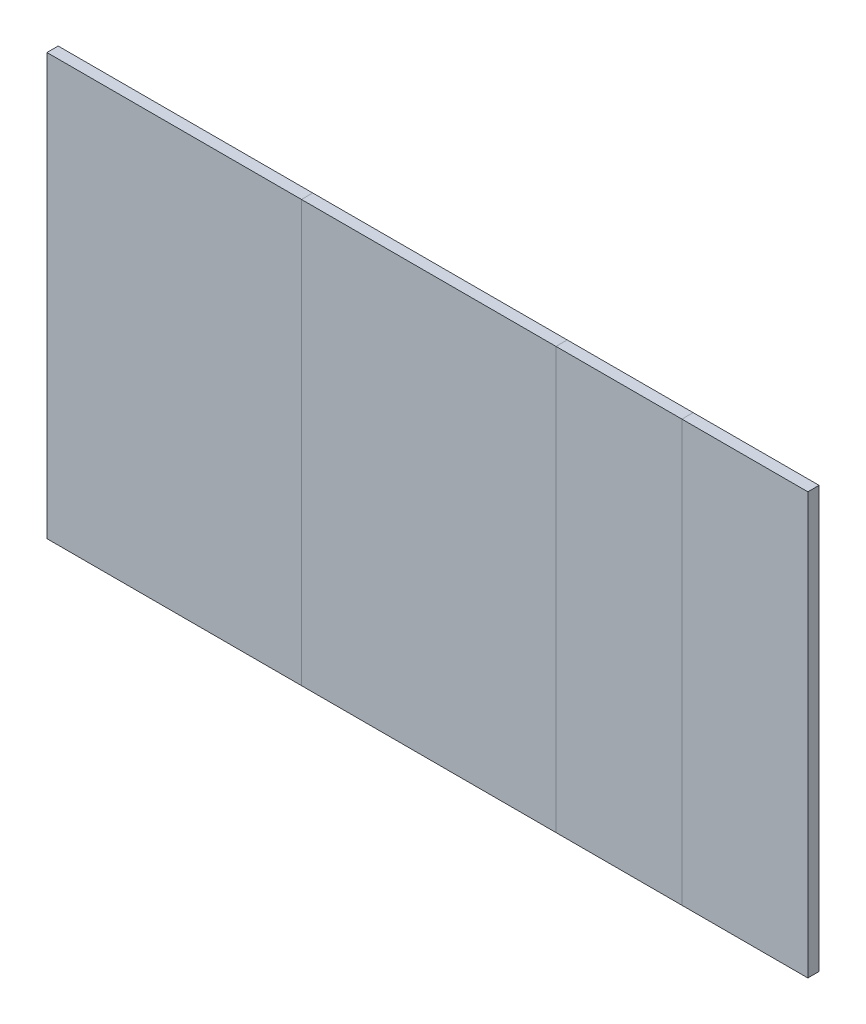
ISO-10303-21;
HEADER;
FILE_DESCRIPTION(('STEP AP214'),'2;1');
FILE_NAME('part.step','',(''),(''),'','','');
FILE_SCHEMA(('AUTOMOTIVE_DESIGN { 1 0 10303 214 1 1 1 1 }'));
ENDSEC;
DATA;
#1=APPLICATION_CONTEXT('core data for automotive mechanical design processes');
#2=APPLICATION_PROTOCOL_DEFINITION('international standard','automotive_design',2000,#1);
#3=PRODUCT_CONTEXT('',#1,'mechanical');
#4=PRODUCT('Part','Part','',(#3));
#5=PRODUCT_RELATED_PRODUCT_CATEGORY('part','',(#4));
#6=PRODUCT_DEFINITION_FORMATION('','',#4);
#7=PRODUCT_DEFINITION_CONTEXT('part definition',#1,'design');
#8=PRODUCT_DEFINITION('design','',#6,#7);
#9=PRODUCT_DEFINITION_SHAPE('','',#8);
#10=(LENGTH_UNIT() NAMED_UNIT(*) SI_UNIT(.MILLI.,.METRE.));
#11=(NAMED_UNIT(*) PLANE_ANGLE_UNIT() SI_UNIT($,.RADIAN.));
#12=(NAMED_UNIT(*) SI_UNIT($,.STERADIAN.) SOLID_ANGLE_UNIT());
#13=UNCERTAINTY_MEASURE_WITH_UNIT(LENGTH_MEASURE(1.E-05),#10,'distance_accuracy_value','');
#14=(GEOMETRIC_REPRESENTATION_CONTEXT(3) GLOBAL_UNCERTAINTY_ASSIGNED_CONTEXT((#13)) GLOBAL_UNIT_ASSIGNED_CONTEXT((#10,
#11,#12)) REPRESENTATION_CONTEXT('',''));
#15=CARTESIAN_POINT('',(0.,0.,0.));
#16=DIRECTION('',(0.,0.,1.));
#17=DIRECTION('',(1.,0.,0.));
#18=AXIS2_PLACEMENT_3D('',#15,#16,#17);
#19=CARTESIAN_POINT('',(1077.214,0.,0.));
#20=DIRECTION('',(1.,0.,0.));
#21=DIRECTION('',(0.,0.,-1.));
#22=AXIS2_PLACEMENT_3D('',#19,#20,#21);
#23=PLANE('',#22);
#24=DIRECTION('',(0.,-1.,0.));
#25=VECTOR('',#24,1.);
#26=CARTESIAN_POINT('',(1077.214,0.,0.));
#27=LINE('',#26,#25);
#28=CARTESIAN_POINT('',(1077.214,714.2734,0.));
#29=VERTEX_POINT('',#28);
#30=CARTESIAN_POINT('',(1077.214,0.,0.));
#31=VERTEX_POINT('',#30);
#32=EDGE_CURVE('E132',#29,#31,#27,.T.);
#33=ORIENTED_EDGE('',*,*,#32,.F.);
#34=DIRECTION('',(0.,0.,1.));
#35=VECTOR('',#34,1.);
#36=CARTESIAN_POINT('',(1077.214,714.2734,19.05));
#37=LINE('',#36,#35);
#38=CARTESIAN_POINT('',(1077.214,714.2734,19.05));
#39=VERTEX_POINT('',#38);
#40=EDGE_CURVE('E110',#29,#39,#37,.T.);
#41=ORIENTED_EDGE('',*,*,#40,.T.);
#42=DIRECTION('',(0.,-1.,0.));
#43=VECTOR('',#42,1.);
#44=CARTESIAN_POINT('',(1077.214,0.,19.05));
#45=LINE('',#44,#43);
#46=CARTESIAN_POINT('',(1077.214,0.,19.05));
#47=VERTEX_POINT('',#46);
#48=EDGE_CURVE('E100',#39,#47,#45,.T.);
#49=ORIENTED_EDGE('',*,*,#48,.T.);
#50=DIRECTION('',(0.,0.,-1.));
#51=VECTOR('',#50,1.);
#52=CARTESIAN_POINT('',(1077.214,0.,19.05));
#53=LINE('',#52,#51);
#54=EDGE_CURVE('E105',#47,#31,#53,.T.);
#55=ORIENTED_EDGE('',*,*,#54,.T.);
#56=EDGE_LOOP('',(#33,#41,#49,#55));
#57=FACE_BOUND('',#56,.T.);
#58=ADVANCED_FACE('F56',(#57),#23,.T.);
#59=CARTESIAN_POINT('',(0.,714.2734,19.05));
#60=DIRECTION('',(0.,-1.,0.));
#61=DIRECTION('',(0.,0.,-1.));
#62=AXIS2_PLACEMENT_3D('',#59,#60,#61);
#63=PLANE('',#62);
#64=ORIENTED_EDGE('',*,*,#40,.F.);
#65=DIRECTION('',(-1.,0.,0.));
#66=VECTOR('',#65,1.);
#67=CARTESIAN_POINT('',(0.,714.2734,0.));
#68=LINE('',#67,#66);
#69=CARTESIAN_POINT('',(863.6,714.2734,0.));
#70=VERTEX_POINT('',#69);
#71=EDGE_CURVE('E102',#29,#70,#68,.T.);
#72=ORIENTED_EDGE('',*,*,#71,.T.);
#73=DIRECTION('',(0.,0.,-1.));
#74=VECTOR('',#73,1.);
#75=CARTESIAN_POINT('',(863.6,714.2734,19.05));
#76=LINE('',#75,#74);
#77=CARTESIAN_POINT('',(863.6,714.2734,19.05));
#78=VERTEX_POINT('',#77);
#79=EDGE_CURVE('E66',#78,#70,#76,.T.);
#80=ORIENTED_EDGE('',*,*,#79,.F.);
#81=DIRECTION('',(-1.,0.,0.));
#82=VECTOR('',#81,1.);
#83=CARTESIAN_POINT('',(0.,714.2734,19.05));
#84=LINE('',#83,#82);
#85=EDGE_CURVE('E60',#39,#78,#84,.T.);
#86=ORIENTED_EDGE('',*,*,#85,.F.);
#87=EDGE_LOOP('',(#64,#72,#80,#86));
#88=FACE_BOUND('',#87,.T.);
#89=ADVANCED_FACE('F137',(#88),#63,.F.);
#90=CARTESIAN_POINT('',(0.,0.,19.05));
#91=DIRECTION('',(0.,1.,0.));
#92=DIRECTION('',(0.,0.,1.));
#93=AXIS2_PLACEMENT_3D('',#90,#91,#92);
#94=PLANE('',#93);
#95=ORIENTED_EDGE('',*,*,#54,.F.);
#96=DIRECTION('',(1.,0.,0.));
#97=VECTOR('',#96,1.);
#98=CARTESIAN_POINT('',(0.,0.,19.05));
#99=LINE('',#98,#97);
#100=CARTESIAN_POINT('',(863.6,0.,19.05));
#101=VERTEX_POINT('',#100);
#102=EDGE_CURVE('E74',#101,#47,#99,.T.);
#103=ORIENTED_EDGE('',*,*,#102,.F.);
#104=DIRECTION('',(0.,0.,1.));
#105=VECTOR('',#104,1.);
#106=CARTESIAN_POINT('',(863.6,0.,19.05));
#107=LINE('',#106,#105);
#108=CARTESIAN_POINT('',(863.6,0.,0.));
#109=VERTEX_POINT('',#108);
#110=EDGE_CURVE('E127',#109,#101,#107,.T.);
#111=ORIENTED_EDGE('',*,*,#110,.F.);
#112=DIRECTION('',(1.,0.,0.));
#113=VECTOR('',#112,1.);
#114=CARTESIAN_POINT('',(0.,0.,0.));
#115=LINE('',#114,#113);
#116=EDGE_CURVE('E108',#109,#31,#115,.T.);
#117=ORIENTED_EDGE('',*,*,#116,.T.);
#118=EDGE_LOOP('',(#95,#103,#111,#117));
#119=FACE_BOUND('',#118,.T.);
#120=ADVANCED_FACE('F106',(#119),#94,.F.);
#121=CARTESIAN_POINT('',(0.,0.,0.));
#122=DIRECTION('',(0.,0.,-1.));
#123=DIRECTION('',(-1.,0.,0.));
#124=AXIS2_PLACEMENT_3D('',#121,#122,#123);
#125=PLANE('',#124);
#126=ORIENTED_EDGE('',*,*,#71,.F.);
#127=ORIENTED_EDGE('',*,*,#32,.T.);
#128=ORIENTED_EDGE('',*,*,#116,.F.);
#129=DIRECTION('',(0.,1.,0.));
#130=VECTOR('',#129,1.);
#131=CARTESIAN_POINT('',(863.6,0.,0.));
#132=LINE('',#131,#130);
#133=EDGE_CURVE('E129',#109,#70,#132,.T.);
#134=ORIENTED_EDGE('',*,*,#133,.T.);
#135=EDGE_LOOP('',(#126,#127,#128,#134));
#136=FACE_BOUND('',#135,.T.);
#137=ADVANCED_FACE('F58',(#136),#125,.T.);
#138=CARTESIAN_POINT('',(0.,0.,19.05));
#139=DIRECTION('',(0.,0.,-1.));
#140=DIRECTION('',(-1.,0.,0.));
#141=AXIS2_PLACEMENT_3D('',#138,#139,#140);
#142=PLANE('',#141);
#143=ORIENTED_EDGE('',*,*,#48,.F.);
#144=ORIENTED_EDGE('',*,*,#85,.T.);
#145=DIRECTION('',(0.,1.,0.));
#146=VECTOR('',#145,1.);
#147=CARTESIAN_POINT('',(863.6,0.,19.05));
#148=LINE('',#147,#146);
#149=EDGE_CURVE('E13',#101,#78,#148,.T.);
#150=ORIENTED_EDGE('',*,*,#149,.F.);
#151=ORIENTED_EDGE('',*,*,#102,.T.);
#152=EDGE_LOOP('',(#143,#144,#150,#151));
#153=FACE_BOUND('',#152,.T.);
#154=ADVANCED_FACE('F98',(#153),#142,.F.);
#155=CARTESIAN_POINT('',(863.6,0.,0.));
#156=DIRECTION('',(-1.,0.,0.));
#157=DIRECTION('',(0.,0.,1.));
#158=AXIS2_PLACEMENT_3D('',#155,#156,#157);
#159=PLANE('',#158);
#160=ORIENTED_EDGE('',*,*,#110,.T.);
#161=ORIENTED_EDGE('',*,*,#149,.T.);
#162=ORIENTED_EDGE('',*,*,#79,.T.);
#163=ORIENTED_EDGE('',*,*,#133,.F.);
#164=EDGE_LOOP('',(#160,#161,#162,#163));
#165=FACE_BOUND('',#164,.T.);
#166=ADVANCED_FACE('F139',(#165),#159,.T.);
#167=CLOSED_SHELL('',(#58,#89,#120,#137,#154,#166));
#168=MANIFOLD_SOLID_BREP('B2',#167);
#169=CARTESIAN_POINT('',(1077.214,0.,0.));
#170=DIRECTION('',(1.,0.,0.));
#171=DIRECTION('',(0.,0.,-1.));
#172=AXIS2_PLACEMENT_3D('',#169,#170,#171);
#173=PLANE('',#172);
#174=DIRECTION('',(0.,-1.,0.));
#175=VECTOR('',#174,1.);
#176=CARTESIAN_POINT('',(1077.214,0.,0.));
#177=LINE('',#176,#175);
#178=CARTESIAN_POINT('',(1077.214,714.2734,0.));
#179=VERTEX_POINT('',#178);
#180=CARTESIAN_POINT('',(1077.214,0.,0.));
#181=VERTEX_POINT('',#180);
#182=EDGE_CURVE('E54',#179,#181,#177,.T.);
#183=ORIENTED_EDGE('',*,*,#182,.T.);
#184=DIRECTION('',(0.,0.,-1.));
#185=VECTOR('',#184,1.);
#186=CARTESIAN_POINT('',(1077.214,0.,19.05));
#187=LINE('',#186,#185);
#188=CARTESIAN_POINT('',(1077.214,0.,19.05));
#189=VERTEX_POINT('',#188);
#190=EDGE_CURVE('E211',#189,#181,#187,.T.);
#191=ORIENTED_EDGE('',*,*,#190,.F.);
#192=DIRECTION('',(0.,-1.,0.));
#193=VECTOR('',#192,1.);
#194=CARTESIAN_POINT('',(1077.214,0.,19.05));
#195=LINE('',#194,#193);
#196=CARTESIAN_POINT('',(1077.214,714.2734,19.05));
#197=VERTEX_POINT('',#196);
#198=EDGE_CURVE('E270',#197,#189,#195,.T.);
#199=ORIENTED_EDGE('',*,*,#198,.F.);
#200=DIRECTION('',(0.,0.,1.));
#201=VECTOR('',#200,1.);
#202=CARTESIAN_POINT('',(1077.214,714.2734,19.05));
#203=LINE('',#202,#201);
#204=EDGE_CURVE('E204',#179,#197,#203,.T.);
#205=ORIENTED_EDGE('',*,*,#204,.F.);
#206=EDGE_LOOP('',(#183,#191,#199,#205));
#207=FACE_BOUND('',#206,.T.);
#208=ADVANCED_FACE('F197',(#207),#173,.F.);
#209=CARTESIAN_POINT('',(1290.828,0.,19.05));
#210=DIRECTION('',(-1.,0.,0.));
#211=DIRECTION('',(0.,0.,1.));
#212=AXIS2_PLACEMENT_3D('',#209,#210,#211);
#213=PLANE('',#212);
#214=DIRECTION('',(0.,1.,0.));
#215=VECTOR('',#214,1.);
#216=CARTESIAN_POINT('',(1290.828,0.,0.));
#217=LINE('',#216,#215);
#218=CARTESIAN_POINT('',(1290.828,0.,0.));
#219=VERTEX_POINT('',#218);
#220=CARTESIAN_POINT('',(1290.828,714.2734,0.));
#221=VERTEX_POINT('',#220);
#222=EDGE_CURVE('E237',#219,#221,#217,.T.);
#223=ORIENTED_EDGE('',*,*,#222,.T.);
#224=DIRECTION('',(0.,0.,-1.));
#225=VECTOR('',#224,1.);
#226=CARTESIAN_POINT('',(1290.828,714.2734,19.05));
#227=LINE('',#226,#225);
#228=CARTESIAN_POINT('',(1290.828,714.2734,19.05));
#229=VERTEX_POINT('',#228);
#230=EDGE_CURVE('E241',#229,#221,#227,.T.);
#231=ORIENTED_EDGE('',*,*,#230,.F.);
#232=DIRECTION('',(0.,1.,0.));
#233=VECTOR('',#232,1.);
#234=CARTESIAN_POINT('',(1290.828,0.,19.05));
#235=LINE('',#234,#233);
#236=CARTESIAN_POINT('',(1290.828,0.,19.05));
#237=VERTEX_POINT('',#236);
#238=EDGE_CURVE('E261',#237,#229,#235,.T.);
#239=ORIENTED_EDGE('',*,*,#238,.F.);
#240=DIRECTION('',(0.,0.,-1.));
#241=VECTOR('',#240,1.);
#242=CARTESIAN_POINT('',(1290.828,0.,19.05));
#243=LINE('',#242,#241);
#244=EDGE_CURVE('E244',#237,#219,#243,.T.);
#245=ORIENTED_EDGE('',*,*,#244,.T.);
#246=EDGE_LOOP('',(#223,#231,#239,#245));
#247=FACE_BOUND('',#246,.T.);
#248=ADVANCED_FACE('F239',(#247),#213,.F.);
#249=CARTESIAN_POINT('',(0.,0.,19.05));
#250=DIRECTION('',(0.,1.,0.));
#251=DIRECTION('',(0.,0.,1.));
#252=AXIS2_PLACEMENT_3D('',#249,#250,#251);
#253=PLANE('',#252);
#254=DIRECTION('',(1.,0.,0.));
#255=VECTOR('',#254,1.);
#256=CARTESIAN_POINT('',(0.,0.,19.05));
#257=LINE('',#256,#255);
#258=EDGE_CURVE('E258',#189,#237,#257,.T.);
#259=ORIENTED_EDGE('',*,*,#258,.F.);
#260=ORIENTED_EDGE('',*,*,#190,.T.);
#261=DIRECTION('',(1.,0.,0.));
#262=VECTOR('',#261,1.);
#263=CARTESIAN_POINT('',(0.,0.,0.));
#264=LINE('',#263,#262);
#265=EDGE_CURVE('E248',#181,#219,#264,.T.);
#266=ORIENTED_EDGE('',*,*,#265,.T.);
#267=ORIENTED_EDGE('',*,*,#244,.F.);
#268=EDGE_LOOP('',(#259,#260,#266,#267));
#269=FACE_BOUND('',#268,.T.);
#270=ADVANCED_FACE('F280',(#269),#253,.F.);
#271=CARTESIAN_POINT('',(0.,714.2734,19.05));
#272=DIRECTION('',(0.,-1.,0.));
#273=DIRECTION('',(0.,0.,-1.));
#274=AXIS2_PLACEMENT_3D('',#271,#272,#273);
#275=PLANE('',#274);
#276=DIRECTION('',(-1.,0.,0.));
#277=VECTOR('',#276,1.);
#278=CARTESIAN_POINT('',(0.,714.2734,0.));
#279=LINE('',#278,#277);
#280=EDGE_CURVE('E249',#221,#179,#279,.T.);
#281=ORIENTED_EDGE('',*,*,#280,.T.);
#282=ORIENTED_EDGE('',*,*,#204,.T.);
#283=DIRECTION('',(-1.,0.,0.));
#284=VECTOR('',#283,1.);
#285=CARTESIAN_POINT('',(0.,714.2734,19.05));
#286=LINE('',#285,#284);
#287=EDGE_CURVE('E255',#229,#197,#286,.T.);
#288=ORIENTED_EDGE('',*,*,#287,.F.);
#289=ORIENTED_EDGE('',*,*,#230,.T.);
#290=EDGE_LOOP('',(#281,#282,#288,#289));
#291=FACE_BOUND('',#290,.T.);
#292=ADVANCED_FACE('F253',(#291),#275,.F.);
#293=CARTESIAN_POINT('',(0.,0.,19.05));
#294=DIRECTION('',(0.,0.,-1.));
#295=DIRECTION('',(-1.,0.,0.));
#296=AXIS2_PLACEMENT_3D('',#293,#294,#295);
#297=PLANE('',#296);
#298=ORIENTED_EDGE('',*,*,#287,.T.);
#299=ORIENTED_EDGE('',*,*,#198,.T.);
#300=ORIENTED_EDGE('',*,*,#258,.T.);
#301=ORIENTED_EDGE('',*,*,#238,.T.);
#302=EDGE_LOOP('',(#298,#299,#300,#301));
#303=FACE_BOUND('',#302,.T.);
#304=ADVANCED_FACE('F275',(#303),#297,.F.);
#305=CARTESIAN_POINT('',(0.,0.,0.));
#306=DIRECTION('',(0.,0.,-1.));
#307=DIRECTION('',(-1.,0.,0.));
#308=AXIS2_PLACEMENT_3D('',#305,#306,#307);
#309=PLANE('',#308);
#310=ORIENTED_EDGE('',*,*,#182,.F.);
#311=ORIENTED_EDGE('',*,*,#280,.F.);
#312=ORIENTED_EDGE('',*,*,#222,.F.);
#313=ORIENTED_EDGE('',*,*,#265,.F.);
#314=EDGE_LOOP('',(#310,#311,#312,#313));
#315=FACE_BOUND('',#314,.T.);
#316=ADVANCED_FACE('F257',(#315),#309,.T.);
#317=CLOSED_SHELL('',(#208,#248,#270,#292,#304,#316));
#318=MANIFOLD_SOLID_BREP('B7',#317);
#319=CARTESIAN_POINT('',(431.8,0.,0.));
#320=DIRECTION('',(-1.,0.,0.));
#321=DIRECTION('',(0.,0.,1.));
#322=AXIS2_PLACEMENT_3D('',#319,#320,#321);
#323=PLANE('',#322);
#324=DIRECTION('',(0.,0.,1.));
#325=VECTOR('',#324,1.);
#326=CARTESIAN_POINT('',(431.8,0.,19.05));
#327=LINE('',#326,#325);
#328=CARTESIAN_POINT('',(431.8,0.,0.));
#329=VERTEX_POINT('',#328);
#330=CARTESIAN_POINT('',(431.8,0.,19.05));
#331=VERTEX_POINT('',#330);
#332=EDGE_CURVE('E389',#329,#331,#327,.T.);
#333=ORIENTED_EDGE('',*,*,#332,.F.);
#334=DIRECTION('',(0.,1.,0.));
#335=VECTOR('',#334,1.);
#336=CARTESIAN_POINT('',(431.8,0.,0.));
#337=LINE('',#336,#335);
#338=CARTESIAN_POINT('',(431.8,714.2734,0.));
#339=VERTEX_POINT('',#338);
#340=EDGE_CURVE('E391',#329,#339,#337,.T.);
#341=ORIENTED_EDGE('',*,*,#340,.T.);
#342=DIRECTION('',(0.,0.,-1.));
#343=VECTOR('',#342,1.);
#344=CARTESIAN_POINT('',(431.8,714.2734,19.05));
#345=LINE('',#344,#343);
#346=CARTESIAN_POINT('',(431.8,714.2734,19.05));
#347=VERTEX_POINT('',#346);
#348=EDGE_CURVE('E383',#347,#339,#345,.T.);
#349=ORIENTED_EDGE('',*,*,#348,.F.);
#350=DIRECTION('',(0.,1.,0.));
#351=VECTOR('',#350,1.);
#352=CARTESIAN_POINT('',(431.8,0.,19.05));
#353=LINE('',#352,#351);
#354=EDGE_CURVE('E374',#331,#347,#353,.T.);
#355=ORIENTED_EDGE('',*,*,#354,.F.);
#356=EDGE_LOOP('',(#333,#341,#349,#355));
#357=FACE_BOUND('',#356,.T.);
#358=ADVANCED_FACE('F337',(#357),#323,.F.);
#359=CARTESIAN_POINT('',(0.,0.,19.05));
#360=DIRECTION('',(1.,0.,0.));
#361=DIRECTION('',(0.,0.,-1.));
#362=AXIS2_PLACEMENT_3D('',#359,#360,#361);
#363=PLANE('',#362);
#364=DIRECTION('',(0.,-1.,0.));
#365=VECTOR('',#364,1.);
#366=CARTESIAN_POINT('',(0.,0.,0.));
#367=LINE('',#366,#365);
#368=CARTESIAN_POINT('',(0.,714.2734,0.));
#369=VERTEX_POINT('',#368);
#370=CARTESIAN_POINT('',(0.,0.,0.));
#371=VERTEX_POINT('',#370);
#372=EDGE_CURVE('E195',#369,#371,#367,.T.);
#373=ORIENTED_EDGE('',*,*,#372,.T.);
#374=DIRECTION('',(0.,0.,-1.));
#375=VECTOR('',#374,1.);
#376=CARTESIAN_POINT('',(0.,0.,19.05));
#377=LINE('',#376,#375);
#378=CARTESIAN_POINT('',(0.,0.,19.05));
#379=VERTEX_POINT('',#378);
#380=EDGE_CURVE('E402',#379,#371,#377,.T.);
#381=ORIENTED_EDGE('',*,*,#380,.F.);
#382=DIRECTION('',(0.,-1.,0.));
#383=VECTOR('',#382,1.);
#384=CARTESIAN_POINT('',(0.,0.,19.05));
#385=LINE('',#384,#383);
#386=CARTESIAN_POINT('',(0.,714.2734,19.05));
#387=VERTEX_POINT('',#386);
#388=EDGE_CURVE('E394',#387,#379,#385,.T.);
#389=ORIENTED_EDGE('',*,*,#388,.F.);
#390=DIRECTION('',(0.,0.,-1.));
#391=VECTOR('',#390,1.);
#392=CARTESIAN_POINT('',(0.,714.2734,19.05));
#393=LINE('',#392,#391);
#394=EDGE_CURVE('E404',#387,#369,#393,.T.);
#395=ORIENTED_EDGE('',*,*,#394,.T.);
#396=EDGE_LOOP('',(#373,#381,#389,#395));
#397=FACE_BOUND('',#396,.T.);
#398=ADVANCED_FACE('F411',(#397),#363,.F.);
#399=CARTESIAN_POINT('',(0.,0.,19.05));
#400=DIRECTION('',(0.,1.,0.));
#401=DIRECTION('',(0.,0.,1.));
#402=AXIS2_PLACEMENT_3D('',#399,#400,#401);
#403=PLANE('',#402);
#404=DIRECTION('',(1.,0.,0.));
#405=VECTOR('',#404,1.);
#406=CARTESIAN_POINT('',(0.,0.,0.));
#407=LINE('',#406,#405);
#408=EDGE_CURVE('E347',#371,#329,#407,.T.);
#409=ORIENTED_EDGE('',*,*,#408,.T.);
#410=ORIENTED_EDGE('',*,*,#332,.T.);
#411=DIRECTION('',(1.,0.,0.));
#412=VECTOR('',#411,1.);
#413=CARTESIAN_POINT('',(0.,0.,19.05));
#414=LINE('',#413,#412);
#415=EDGE_CURVE('E396',#379,#331,#414,.T.);
#416=ORIENTED_EDGE('',*,*,#415,.F.);
#417=ORIENTED_EDGE('',*,*,#380,.T.);
#418=EDGE_LOOP('',(#409,#410,#416,#417));
#419=FACE_BOUND('',#418,.T.);
#420=ADVANCED_FACE('F408',(#419),#403,.F.);
#421=CARTESIAN_POINT('',(0.,714.2734,19.05));
#422=DIRECTION('',(0.,-1.,0.));
#423=DIRECTION('',(0.,0.,-1.));
#424=AXIS2_PLACEMENT_3D('',#421,#422,#423);
#425=PLANE('',#424);
#426=DIRECTION('',(-1.,0.,0.));
#427=VECTOR('',#426,1.);
#428=CARTESIAN_POINT('',(0.,714.2734,19.05));
#429=LINE('',#428,#427);
#430=EDGE_CURVE('E341',#347,#387,#429,.T.);
#431=ORIENTED_EDGE('',*,*,#430,.F.);
#432=ORIENTED_EDGE('',*,*,#348,.T.);
#433=DIRECTION('',(-1.,0.,0.));
#434=VECTOR('',#433,1.);
#435=CARTESIAN_POINT('',(0.,714.2734,0.));
#436=LINE('',#435,#434);
#437=EDGE_CURVE('E387',#339,#369,#436,.T.);
#438=ORIENTED_EDGE('',*,*,#437,.T.);
#439=ORIENTED_EDGE('',*,*,#394,.F.);
#440=EDGE_LOOP('',(#431,#432,#438,#439));
#441=FACE_BOUND('',#440,.T.);
#442=ADVANCED_FACE('F385',(#441),#425,.F.);
#443=CARTESIAN_POINT('',(0.,0.,19.05));
#444=DIRECTION('',(0.,0.,-1.));
#445=DIRECTION('',(-1.,0.,0.));
#446=AXIS2_PLACEMENT_3D('',#443,#444,#445);
#447=PLANE('',#446);
#448=ORIENTED_EDGE('',*,*,#415,.T.);
#449=ORIENTED_EDGE('',*,*,#354,.T.);
#450=ORIENTED_EDGE('',*,*,#430,.T.);
#451=ORIENTED_EDGE('',*,*,#388,.T.);
#452=EDGE_LOOP('',(#448,#449,#450,#451));
#453=FACE_BOUND('',#452,.T.);
#454=ADVANCED_FACE('F339',(#453),#447,.F.);
#455=CARTESIAN_POINT('',(0.,0.,0.));
#456=DIRECTION('',(0.,0.,-1.));
#457=DIRECTION('',(-1.,0.,0.));
#458=AXIS2_PLACEMENT_3D('',#455,#456,#457);
#459=PLANE('',#458);
#460=ORIENTED_EDGE('',*,*,#340,.F.);
#461=ORIENTED_EDGE('',*,*,#408,.F.);
#462=ORIENTED_EDGE('',*,*,#372,.F.);
#463=ORIENTED_EDGE('',*,*,#437,.F.);
#464=EDGE_LOOP('',(#460,#461,#462,#463));
#465=FACE_BOUND('',#464,.T.);
#466=ADVANCED_FACE('F393',(#465),#459,.T.);
#467=CLOSED_SHELL('',(#358,#398,#420,#442,#454,#466));
#468=MANIFOLD_SOLID_BREP('B48',#467);
#469=CARTESIAN_POINT('',(863.6,0.,0.));
#470=DIRECTION('',(-1.,0.,0.));
#471=DIRECTION('',(0.,0.,1.));
#472=AXIS2_PLACEMENT_3D('',#469,#470,#471);
#473=PLANE('',#472);
#474=DIRECTION('',(0.,0.,1.));
#475=VECTOR('',#474,1.);
#476=CARTESIAN_POINT('',(863.6,0.,19.05));
#477=LINE('',#476,#475);
#478=CARTESIAN_POINT('',(863.6,0.,0.));
#479=VERTEX_POINT('',#478);
#480=CARTESIAN_POINT('',(863.6,0.,19.05));
#481=VERTEX_POINT('',#480);
#482=EDGE_CURVE('E526',#479,#481,#477,.T.);
#483=ORIENTED_EDGE('',*,*,#482,.F.);
#484=DIRECTION('',(0.,1.,0.));
#485=VECTOR('',#484,1.);
#486=CARTESIAN_POINT('',(863.6,0.,0.));
#487=LINE('',#486,#485);
#488=CARTESIAN_POINT('',(863.6,714.2734,0.));
#489=VERTEX_POINT('',#488);
#490=EDGE_CURVE('E335',#479,#489,#487,.T.);
#491=ORIENTED_EDGE('',*,*,#490,.T.);
#492=DIRECTION('',(0.,0.,-1.));
#493=VECTOR('',#492,1.);
#494=CARTESIAN_POINT('',(863.6,714.2734,19.05));
#495=LINE('',#494,#493);
#496=CARTESIAN_POINT('',(863.6,714.2734,19.05));
#497=VERTEX_POINT('',#496);
#498=EDGE_CURVE('E474',#497,#489,#495,.T.);
#499=ORIENTED_EDGE('',*,*,#498,.F.);
#500=DIRECTION('',(0.,1.,0.));
#501=VECTOR('',#500,1.);
#502=CARTESIAN_POINT('',(863.6,0.,19.05));
#503=LINE('',#502,#501);
#504=EDGE_CURVE('E507',#481,#497,#503,.T.);
#505=ORIENTED_EDGE('',*,*,#504,.F.);
#506=EDGE_LOOP('',(#483,#491,#499,#505));
#507=FACE_BOUND('',#506,.T.);
#508=ADVANCED_FACE('F459',(#507),#473,.F.);
#509=CARTESIAN_POINT('',(431.8,0.,0.));
#510=DIRECTION('',(-1.,0.,0.));
#511=DIRECTION('',(0.,0.,1.));
#512=AXIS2_PLACEMENT_3D('',#509,#510,#511);
#513=PLANE('',#512);
#514=DIRECTION('',(0.,0.,1.));
#515=VECTOR('',#514,1.);
#516=CARTESIAN_POINT('',(431.8,0.,19.05));
#517=LINE('',#516,#515);
#518=CARTESIAN_POINT('',(431.8,0.,0.));
#519=VERTEX_POINT('',#518);
#520=CARTESIAN_POINT('',(431.8,0.,19.05));
#521=VERTEX_POINT('',#520);
#522=EDGE_CURVE('E515',#519,#521,#517,.T.);
#523=ORIENTED_EDGE('',*,*,#522,.T.);
#524=DIRECTION('',(0.,1.,0.));
#525=VECTOR('',#524,1.);
#526=CARTESIAN_POINT('',(431.8,0.,19.05));
#527=LINE('',#526,#525);
#528=CARTESIAN_POINT('',(431.8,714.2734,19.05));
#529=VERTEX_POINT('',#528);
#530=EDGE_CURVE('E462',#521,#529,#527,.T.);
#531=ORIENTED_EDGE('',*,*,#530,.T.);
#532=DIRECTION('',(0.,0.,-1.));
#533=VECTOR('',#532,1.);
#534=CARTESIAN_POINT('',(431.8,714.2734,19.05));
#535=LINE('',#534,#533);
#536=CARTESIAN_POINT('',(431.8,714.2734,0.));
#537=VERTEX_POINT('',#536);
#538=EDGE_CURVE('E512',#529,#537,#535,.T.);
#539=ORIENTED_EDGE('',*,*,#538,.T.);
#540=DIRECTION('',(0.,1.,0.));
#541=VECTOR('',#540,1.);
#542=CARTESIAN_POINT('',(431.8,0.,0.));
#543=LINE('',#542,#541);
#544=EDGE_CURVE('E498',#519,#537,#543,.T.);
#545=ORIENTED_EDGE('',*,*,#544,.F.);
#546=EDGE_LOOP('',(#523,#531,#539,#545));
#547=FACE_BOUND('',#546,.T.);
#548=ADVANCED_FACE('F513',(#547),#513,.T.);
#549=CARTESIAN_POINT('',(0.,714.2734,19.05));
#550=DIRECTION('',(0.,-1.,0.));
#551=DIRECTION('',(0.,0.,-1.));
#552=AXIS2_PLACEMENT_3D('',#549,#550,#551);
#553=PLANE('',#552);
#554=ORIENTED_EDGE('',*,*,#538,.F.);
#555=DIRECTION('',(-1.,0.,0.));
#556=VECTOR('',#555,1.);
#557=CARTESIAN_POINT('',(0.,714.2734,19.05));
#558=LINE('',#557,#556);
#559=EDGE_CURVE('E508',#497,#529,#558,.T.);
#560=ORIENTED_EDGE('',*,*,#559,.F.);
#561=ORIENTED_EDGE('',*,*,#498,.T.);
#562=DIRECTION('',(-1.,0.,0.));
#563=VECTOR('',#562,1.);
#564=CARTESIAN_POINT('',(0.,714.2734,0.));
#565=LINE('',#564,#563);
#566=EDGE_CURVE('E501',#489,#537,#565,.T.);
#567=ORIENTED_EDGE('',*,*,#566,.T.);
#568=EDGE_LOOP('',(#554,#560,#561,#567));
#569=FACE_BOUND('',#568,.T.);
#570=ADVANCED_FACE('F517',(#569),#553,.F.);
#571=CARTESIAN_POINT('',(0.,0.,19.05));
#572=DIRECTION('',(0.,1.,0.));
#573=DIRECTION('',(0.,0.,1.));
#574=AXIS2_PLACEMENT_3D('',#571,#572,#573);
#575=PLANE('',#574);
#576=ORIENTED_EDGE('',*,*,#522,.F.);
#577=DIRECTION('',(1.,0.,0.));
#578=VECTOR('',#577,1.);
#579=CARTESIAN_POINT('',(0.,0.,0.));
#580=LINE('',#579,#578);
#581=EDGE_CURVE('E503',#519,#479,#580,.T.);
#582=ORIENTED_EDGE('',*,*,#581,.T.);
#583=ORIENTED_EDGE('',*,*,#482,.T.);
#584=DIRECTION('',(1.,0.,0.));
#585=VECTOR('',#584,1.);
#586=CARTESIAN_POINT('',(0.,0.,19.05));
#587=LINE('',#586,#585);
#588=EDGE_CURVE('E518',#521,#481,#587,.T.);
#589=ORIENTED_EDGE('',*,*,#588,.F.);
#590=EDGE_LOOP('',(#576,#582,#583,#589));
#591=FACE_BOUND('',#590,.T.);
#592=ADVANCED_FACE('F533',(#591),#575,.F.);
#593=CARTESIAN_POINT('',(0.,0.,0.));
#594=DIRECTION('',(0.,0.,-1.));
#595=DIRECTION('',(-1.,0.,0.));
#596=AXIS2_PLACEMENT_3D('',#593,#594,#595);
#597=PLANE('',#596);
#598=ORIENTED_EDGE('',*,*,#581,.F.);
#599=ORIENTED_EDGE('',*,*,#544,.T.);
#600=ORIENTED_EDGE('',*,*,#566,.F.);
#601=ORIENTED_EDGE('',*,*,#490,.F.);
#602=EDGE_LOOP('',(#598,#599,#600,#601));
#603=FACE_BOUND('',#602,.T.);
#604=ADVANCED_FACE('F500',(#603),#597,.T.);
#605=CARTESIAN_POINT('',(0.,0.,19.05));
#606=DIRECTION('',(0.,0.,-1.));
#607=DIRECTION('',(-1.,0.,0.));
#608=AXIS2_PLACEMENT_3D('',#605,#606,#607);
#609=PLANE('',#608);
#610=ORIENTED_EDGE('',*,*,#530,.F.);
#611=ORIENTED_EDGE('',*,*,#588,.T.);
#612=ORIENTED_EDGE('',*,*,#504,.T.);
#613=ORIENTED_EDGE('',*,*,#559,.T.);
#614=EDGE_LOOP('',(#610,#611,#612,#613));
#615=FACE_BOUND('',#614,.T.);
#616=ADVANCED_FACE('F531',(#615),#609,.F.);
#617=CLOSED_SHELL('',(#508,#548,#570,#592,#604,#616));
#618=MANIFOLD_SOLID_BREP('B189',#617);
#619=ADVANCED_BREP_SHAPE_REPRESENTATION('',(#18,#168,#318,#468,#618),#14);
#620=SHAPE_DEFINITION_REPRESENTATION(#9,#619);
ENDSEC;
END-ISO-10303-21;
